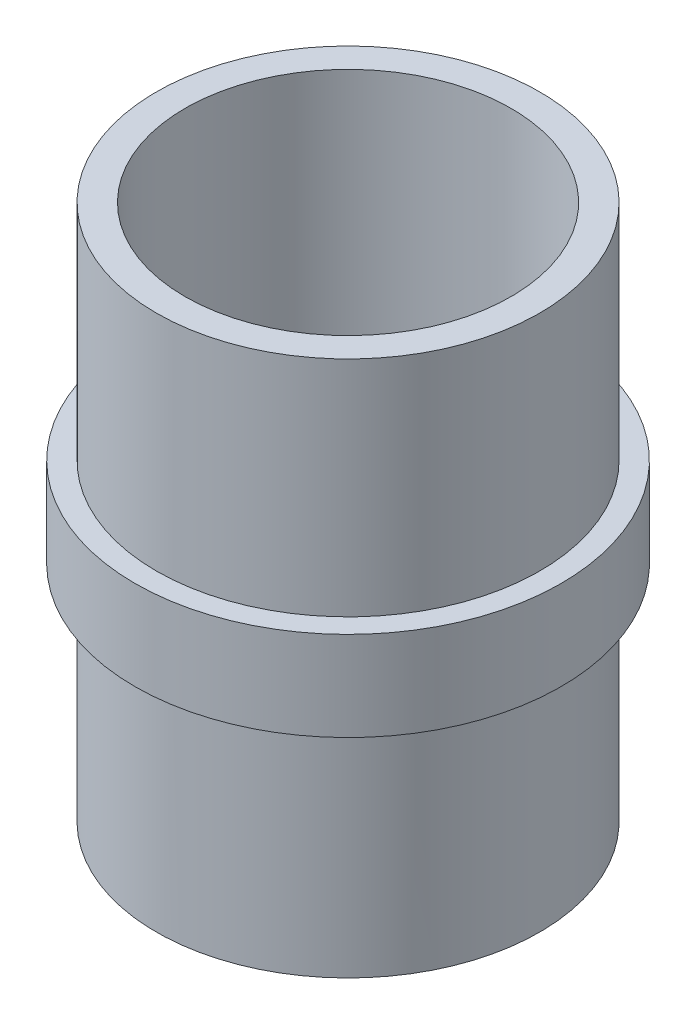
ISO-10303-21;
HEADER;
FILE_DESCRIPTION(('STEP AP214'),'2;1');
FILE_NAME('part.step','',(''),(''),'','','');
FILE_SCHEMA(('AUTOMOTIVE_DESIGN { 1 0 10303 214 1 1 1 1 }'));
ENDSEC;
DATA;
#1=APPLICATION_CONTEXT('core data for automotive mechanical design processes');
#2=APPLICATION_PROTOCOL_DEFINITION('international standard','automotive_design',2000,#1);
#3=PRODUCT_CONTEXT('',#1,'mechanical');
#4=PRODUCT('Part','Part','',(#3));
#5=PRODUCT_RELATED_PRODUCT_CATEGORY('part','',(#4));
#6=PRODUCT_DEFINITION_FORMATION('','',#4);
#7=PRODUCT_DEFINITION_CONTEXT('part definition',#1,'design');
#8=PRODUCT_DEFINITION('design','',#6,#7);
#9=PRODUCT_DEFINITION_SHAPE('','',#8);
#10=(LENGTH_UNIT() NAMED_UNIT(*) SI_UNIT(.MILLI.,.METRE.));
#11=(NAMED_UNIT(*) PLANE_ANGLE_UNIT() SI_UNIT($,.RADIAN.));
#12=(NAMED_UNIT(*) SI_UNIT($,.STERADIAN.) SOLID_ANGLE_UNIT());
#13=UNCERTAINTY_MEASURE_WITH_UNIT(LENGTH_MEASURE(1.E-05),#10,'distance_accuracy_value','');
#14=(GEOMETRIC_REPRESENTATION_CONTEXT(3) GLOBAL_UNCERTAINTY_ASSIGNED_CONTEXT((#13)) GLOBAL_UNIT_ASSIGNED_CONTEXT((#10,
#11,#12)) REPRESENTATION_CONTEXT('',''));
#15=CARTESIAN_POINT('',(0.,0.,0.));
#16=DIRECTION('',(0.,0.,1.));
#17=DIRECTION('',(1.,0.,0.));
#18=AXIS2_PLACEMENT_3D('',#15,#16,#17);
#19=CARTESIAN_POINT('',(0.,36.,0.));
#20=DIRECTION('',(0.,-1.,0.));
#21=DIRECTION('',(0.,0.,-1.));
#22=AXIS2_PLACEMENT_3D('',#19,#20,#21);
#23=CYLINDRICAL_SURFACE('',#22,10.725);
#24=CARTESIAN_POINT('',(0.,15.5,0.));
#25=DIRECTION('',(0.,1.,0.));
#26=DIRECTION('',(0.,0.,1.));
#27=AXIS2_PLACEMENT_3D('',#24,#25,#26);
#28=CIRCLE('',#27,10.725);
#29=CARTESIAN_POINT('',(0.,15.5,10.725));
#30=VERTEX_POINT('',#29);
#31=EDGE_CURVE('E10',#30,#30,#28,.T.);
#32=ORIENTED_EDGE('',*,*,#31,.F.);
#33=EDGE_LOOP('',(#32));
#34=FACE_BOUND('',#33,.T.);
#35=CARTESIAN_POINT('',(0.,3.,0.));
#36=DIRECTION('',(0.,-1.,0.));
#37=DIRECTION('',(0.,0.,-1.));
#38=AXIS2_PLACEMENT_3D('',#35,#36,#37);
#39=CIRCLE('',#38,10.725);
#40=CARTESIAN_POINT('',(0.,3.,-10.725));
#41=VERTEX_POINT('',#40);
#42=EDGE_CURVE('E66',#41,#41,#39,.T.);
#43=ORIENTED_EDGE('',*,*,#42,.F.);
#44=EDGE_LOOP('',(#43));
#45=FACE_BOUND('',#44,.T.);
#46=ADVANCED_FACE('F37',(#34,#45),#23,.T.);
#47=CARTESIAN_POINT('',(0.,20.5,0.));
#48=DIRECTION('',(0.,1.,0.));
#49=DIRECTION('',(0.,0.,1.));
#50=AXIS2_PLACEMENT_3D('',#47,#48,#49);
#51=CIRCLE('',#50,10.725);
#52=CARTESIAN_POINT('',(0.,20.5,10.725));
#53=VERTEX_POINT('',#52);
#54=EDGE_CURVE('E46',#53,#53,#51,.T.);
#55=ORIENTED_EDGE('',*,*,#54,.T.);
#56=EDGE_LOOP('',(#55));
#57=FACE_BOUND('',#56,.T.);
#58=CARTESIAN_POINT('',(0.,33.,0.));
#59=DIRECTION('',(0.,1.,0.));
#60=DIRECTION('',(0.,0.,1.));
#61=AXIS2_PLACEMENT_3D('',#58,#59,#60);
#62=CIRCLE('',#61,10.725);
#63=CARTESIAN_POINT('',(0.,33.,10.725));
#64=VERTEX_POINT('',#63);
#65=EDGE_CURVE('E65',#64,#64,#62,.T.);
#66=ORIENTED_EDGE('',*,*,#65,.F.);
#67=EDGE_LOOP('',(#66));
#68=FACE_BOUND('',#67,.T.);
#69=ADVANCED_FACE('F39',(#57,#68),#23,.T.);
#70=CARTESIAN_POINT('',(0.,15.5,0.));
#71=DIRECTION('',(0.,1.,0.));
#72=DIRECTION('',(0.,0.,1.));
#73=AXIS2_PLACEMENT_3D('',#70,#71,#72);
#74=CYLINDRICAL_SURFACE('',#73,11.925);
#75=CARTESIAN_POINT('',(0.,15.5,0.));
#76=DIRECTION('',(0.,1.,0.));
#77=DIRECTION('',(0.,0.,1.));
#78=AXIS2_PLACEMENT_3D('',#75,#76,#77);
#79=CIRCLE('',#78,11.925);
#80=CARTESIAN_POINT('',(0.,15.5,11.925));
#81=VERTEX_POINT('',#80);
#82=EDGE_CURVE('E51',#81,#81,#79,.T.);
#83=ORIENTED_EDGE('',*,*,#82,.T.);
#84=EDGE_LOOP('',(#83));
#85=FACE_BOUND('',#84,.T.);
#86=CARTESIAN_POINT('',(0.,20.5,0.));
#87=DIRECTION('',(0.,1.,0.));
#88=DIRECTION('',(0.,0.,1.));
#89=AXIS2_PLACEMENT_3D('',#86,#87,#88);
#90=CIRCLE('',#89,11.925);
#91=CARTESIAN_POINT('',(0.,20.5,11.925));
#92=VERTEX_POINT('',#91);
#93=EDGE_CURVE('E57',#92,#92,#90,.T.);
#94=ORIENTED_EDGE('',*,*,#93,.F.);
#95=EDGE_LOOP('',(#94));
#96=FACE_BOUND('',#95,.T.);
#97=ADVANCED_FACE('F82',(#85,#96),#74,.T.);
#98=CARTESIAN_POINT('',(0.,15.5,0.));
#99=DIRECTION('',(0.,1.,0.));
#100=DIRECTION('',(0.,0.,1.));
#101=AXIS2_PLACEMENT_3D('',#98,#99,#100);
#102=PLANE('',#101);
#103=ORIENTED_EDGE('',*,*,#31,.T.);
#104=EDGE_LOOP('',(#103));
#105=FACE_BOUND('',#104,.T.);
#106=ORIENTED_EDGE('',*,*,#82,.F.);
#107=EDGE_LOOP('',(#106));
#108=FACE_BOUND('',#107,.T.);
#109=ADVANCED_FACE('F87',(#105,#108),#102,.F.);
#110=CARTESIAN_POINT('',(0.,20.5,0.));
#111=DIRECTION('',(0.,1.,0.));
#112=DIRECTION('',(0.,0.,1.));
#113=AXIS2_PLACEMENT_3D('',#110,#111,#112);
#114=PLANE('',#113);
#115=ORIENTED_EDGE('',*,*,#54,.F.);
#116=EDGE_LOOP('',(#115));
#117=FACE_BOUND('',#116,.T.);
#118=ORIENTED_EDGE('',*,*,#93,.T.);
#119=EDGE_LOOP('',(#118));
#120=FACE_BOUND('',#119,.T.);
#121=ADVANCED_FACE('F97',(#117,#120),#114,.T.);
#122=CARTESIAN_POINT('',(0.,33.,0.));
#123=DIRECTION('',(0.,1.,0.));
#124=DIRECTION('',(0.,0.,1.));
#125=AXIS2_PLACEMENT_3D('',#122,#123,#124);
#126=PLANE('',#125);
#127=ORIENTED_EDGE('',*,*,#65,.T.);
#128=EDGE_LOOP('',(#127));
#129=FACE_BOUND('',#128,.T.);
#130=CARTESIAN_POINT('',(0.,33.,0.));
#131=DIRECTION('',(0.,1.,0.));
#132=DIRECTION('',(0.,0.,1.));
#133=AXIS2_PLACEMENT_3D('',#130,#131,#132);
#134=CIRCLE('',#133,9.125);
#135=CARTESIAN_POINT('',(0.,33.,9.125));
#136=VERTEX_POINT('',#135);
#137=EDGE_CURVE('E41',#136,#136,#134,.F.);
#138=ORIENTED_EDGE('',*,*,#137,.T.);
#139=EDGE_LOOP('',(#138));
#140=FACE_BOUND('',#139,.T.);
#141=ADVANCED_FACE('F93',(#129,#140),#126,.T.);
#142=CARTESIAN_POINT('',(0.,3.,0.));
#143=DIRECTION('',(0.,1.,0.));
#144=DIRECTION('',(0.,0.,1.));
#145=AXIS2_PLACEMENT_3D('',#142,#143,#144);
#146=CYLINDRICAL_SURFACE('',#145,9.125);
#147=CARTESIAN_POINT('',(0.,3.,0.));
#148=DIRECTION('',(0.,1.,0.));
#149=DIRECTION('',(0.,0.,1.));
#150=AXIS2_PLACEMENT_3D('',#147,#148,#149);
#151=CIRCLE('',#150,9.125);
#152=CARTESIAN_POINT('',(0.,3.,9.125));
#153=VERTEX_POINT('',#152);
#154=EDGE_CURVE('E61',#153,#153,#151,.T.);
#155=ORIENTED_EDGE('',*,*,#154,.F.);
#156=EDGE_LOOP('',(#155));
#157=FACE_BOUND('',#156,.T.);
#158=ORIENTED_EDGE('',*,*,#137,.F.);
#159=EDGE_LOOP('',(#158));
#160=FACE_BOUND('',#159,.T.);
#161=ADVANCED_FACE('F96',(#157,#160),#146,.F.);
#162=CARTESIAN_POINT('',(0.,3.,0.));
#163=DIRECTION('',(0.,-1.,0.));
#164=DIRECTION('',(0.,0.,-1.));
#165=AXIS2_PLACEMENT_3D('',#162,#163,#164);
#166=PLANE('',#165);
#167=ORIENTED_EDGE('',*,*,#42,.T.);
#168=EDGE_LOOP('',(#167));
#169=FACE_BOUND('',#168,.T.);
#170=ORIENTED_EDGE('',*,*,#154,.T.);
#171=EDGE_LOOP('',(#170));
#172=FACE_BOUND('',#171,.T.);
#173=ADVANCED_FACE('F74',(#169,#172),#166,.T.);
#174=CLOSED_SHELL('',(#46,#69,#97,#109,#121,#141,#161,#173));
#175=MANIFOLD_SOLID_BREP('B2',#174);
#176=ADVANCED_BREP_SHAPE_REPRESENTATION('',(#18,#175),#14);
#177=SHAPE_DEFINITION_REPRESENTATION(#9,#176);
ENDSEC;
END-ISO-10303-21;
